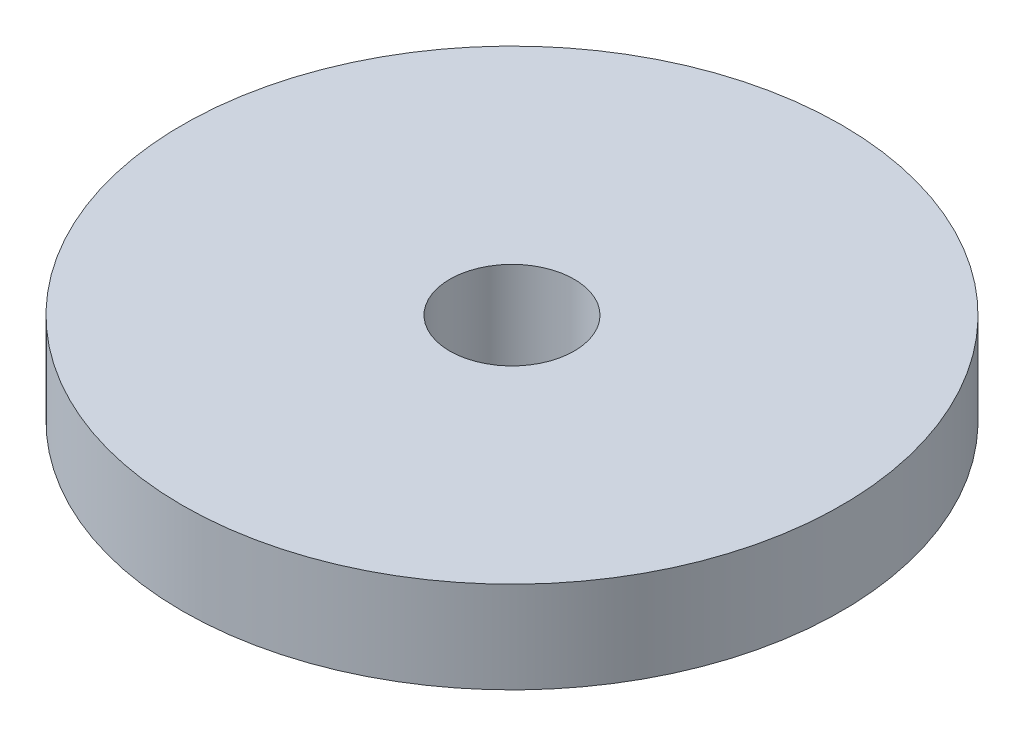
ISO-10303-21;
HEADER;
FILE_DESCRIPTION(('STEP AP214'),'2;1');
FILE_NAME('part.step','',(''),(''),'','','');
FILE_SCHEMA(('AUTOMOTIVE_DESIGN { 1 0 10303 214 1 1 1 1 }'));
ENDSEC;
DATA;
#1=APPLICATION_CONTEXT('core data for automotive mechanical design processes');
#2=APPLICATION_PROTOCOL_DEFINITION('international standard','automotive_design',2000,#1);
#3=PRODUCT_CONTEXT('',#1,'mechanical');
#4=PRODUCT('Part','Part','',(#3));
#5=PRODUCT_RELATED_PRODUCT_CATEGORY('part','',(#4));
#6=PRODUCT_DEFINITION_FORMATION('','',#4);
#7=PRODUCT_DEFINITION_CONTEXT('part definition',#1,'design');
#8=PRODUCT_DEFINITION('design','',#6,#7);
#9=PRODUCT_DEFINITION_SHAPE('','',#8);
#10=(LENGTH_UNIT() NAMED_UNIT(*) SI_UNIT(.MILLI.,.METRE.));
#11=(NAMED_UNIT(*) PLANE_ANGLE_UNIT() SI_UNIT($,.RADIAN.));
#12=(NAMED_UNIT(*) SI_UNIT($,.STERADIAN.) SOLID_ANGLE_UNIT());
#13=UNCERTAINTY_MEASURE_WITH_UNIT(LENGTH_MEASURE(1.E-05),#10,'distance_accuracy_value','');
#14=(GEOMETRIC_REPRESENTATION_CONTEXT(3) GLOBAL_UNCERTAINTY_ASSIGNED_CONTEXT((#13)) GLOBAL_UNIT_ASSIGNED_CONTEXT((#10,
#11,#12)) REPRESENTATION_CONTEXT('',''));
#15=CARTESIAN_POINT('',(0.,0.,0.));
#16=DIRECTION('',(0.,0.,1.));
#17=DIRECTION('',(1.,0.,0.));
#18=AXIS2_PLACEMENT_3D('',#15,#16,#17);
#19=CARTESIAN_POINT('',(0.,2.5,0.));
#20=DIRECTION('',(0.,1.,0.));
#21=DIRECTION('',(0.,0.,1.));
#22=AXIS2_PLACEMENT_3D('',#19,#20,#21);
#23=PLANE('',#22);
#24=CARTESIAN_POINT('',(0.,2.5,0.));
#25=DIRECTION('',(0.,1.,0.));
#26=DIRECTION('',(0.,0.,1.));
#27=AXIS2_PLACEMENT_3D('',#24,#25,#26);
#28=CIRCLE('',#27,9.);
#29=CARTESIAN_POINT('',(0.,2.5,9.));
#30=VERTEX_POINT('',#29);
#31=EDGE_CURVE('E10',#30,#30,#28,.T.);
#32=ORIENTED_EDGE('',*,*,#31,.T.);
#33=EDGE_LOOP('',(#32));
#34=FACE_BOUND('',#33,.T.);
#35=CARTESIAN_POINT('',(0.,2.5,0.));
#36=DIRECTION('',(0.,1.,0.));
#37=DIRECTION('',(0.,0.,1.));
#38=AXIS2_PLACEMENT_3D('',#35,#36,#37);
#39=CIRCLE('',#38,1.7);
#40=CARTESIAN_POINT('',(0.,2.5,1.7));
#41=VERTEX_POINT('',#40);
#42=EDGE_CURVE('E42',#41,#41,#39,.T.);
#43=ORIENTED_EDGE('',*,*,#42,.F.);
#44=EDGE_LOOP('',(#43));
#45=FACE_BOUND('',#44,.T.);
#46=ADVANCED_FACE('F31',(#34,#45),#23,.T.);
#47=CARTESIAN_POINT('',(0.,0.,0.));
#48=DIRECTION('',(0.,1.,0.));
#49=DIRECTION('',(0.,0.,1.));
#50=AXIS2_PLACEMENT_3D('',#47,#48,#49);
#51=PLANE('',#50);
#52=CARTESIAN_POINT('',(0.,0.,0.));
#53=DIRECTION('',(0.,1.,0.));
#54=DIRECTION('',(0.,0.,1.));
#55=AXIS2_PLACEMENT_3D('',#52,#53,#54);
#56=CIRCLE('',#55,9.);
#57=CARTESIAN_POINT('',(0.,0.,9.));
#58=VERTEX_POINT('',#57);
#59=EDGE_CURVE('E35',#58,#58,#56,.T.);
#60=ORIENTED_EDGE('',*,*,#59,.F.);
#61=EDGE_LOOP('',(#60));
#62=FACE_BOUND('',#61,.T.);
#63=CARTESIAN_POINT('',(0.,0.,0.));
#64=DIRECTION('',(0.,1.,0.));
#65=DIRECTION('',(0.,0.,1.));
#66=AXIS2_PLACEMENT_3D('',#63,#64,#65);
#67=CIRCLE('',#66,1.7);
#68=CARTESIAN_POINT('',(0.,0.,1.7));
#69=VERTEX_POINT('',#68);
#70=EDGE_CURVE('E44',#69,#69,#67,.T.);
#71=ORIENTED_EDGE('',*,*,#70,.T.);
#72=EDGE_LOOP('',(#71));
#73=FACE_BOUND('',#72,.T.);
#74=ADVANCED_FACE('F54',(#62,#73),#51,.F.);
#75=CARTESIAN_POINT('',(0.,2.5,0.));
#76=DIRECTION('',(0.,-1.,0.));
#77=DIRECTION('',(0.,0.,-1.));
#78=AXIS2_PLACEMENT_3D('',#75,#76,#77);
#79=CYLINDRICAL_SURFACE('',#78,9.);
#80=ORIENTED_EDGE('',*,*,#31,.F.);
#81=EDGE_LOOP('',(#80));
#82=FACE_BOUND('',#81,.T.);
#83=ORIENTED_EDGE('',*,*,#59,.T.);
#84=EDGE_LOOP('',(#83));
#85=FACE_BOUND('',#84,.T.);
#86=ADVANCED_FACE('F33',(#82,#85),#79,.T.);
#87=CARTESIAN_POINT('',(0.,2.5,0.));
#88=DIRECTION('',(0.,-1.,0.));
#89=DIRECTION('',(0.,0.,-1.));
#90=AXIS2_PLACEMENT_3D('',#87,#88,#89);
#91=CYLINDRICAL_SURFACE('',#90,1.7);
#92=ORIENTED_EDGE('',*,*,#42,.T.);
#93=EDGE_LOOP('',(#92));
#94=FACE_BOUND('',#93,.T.);
#95=ORIENTED_EDGE('',*,*,#70,.F.);
#96=EDGE_LOOP('',(#95));
#97=FACE_BOUND('',#96,.T.);
#98=ADVANCED_FACE('F50',(#94,#97),#91,.F.);
#99=CLOSED_SHELL('',(#46,#74,#86,#98));
#100=MANIFOLD_SOLID_BREP('B2',#99);
#101=ADVANCED_BREP_SHAPE_REPRESENTATION('',(#18,#100),#14);
#102=SHAPE_DEFINITION_REPRESENTATION(#9,#101);
ENDSEC;
END-ISO-10303-21;
